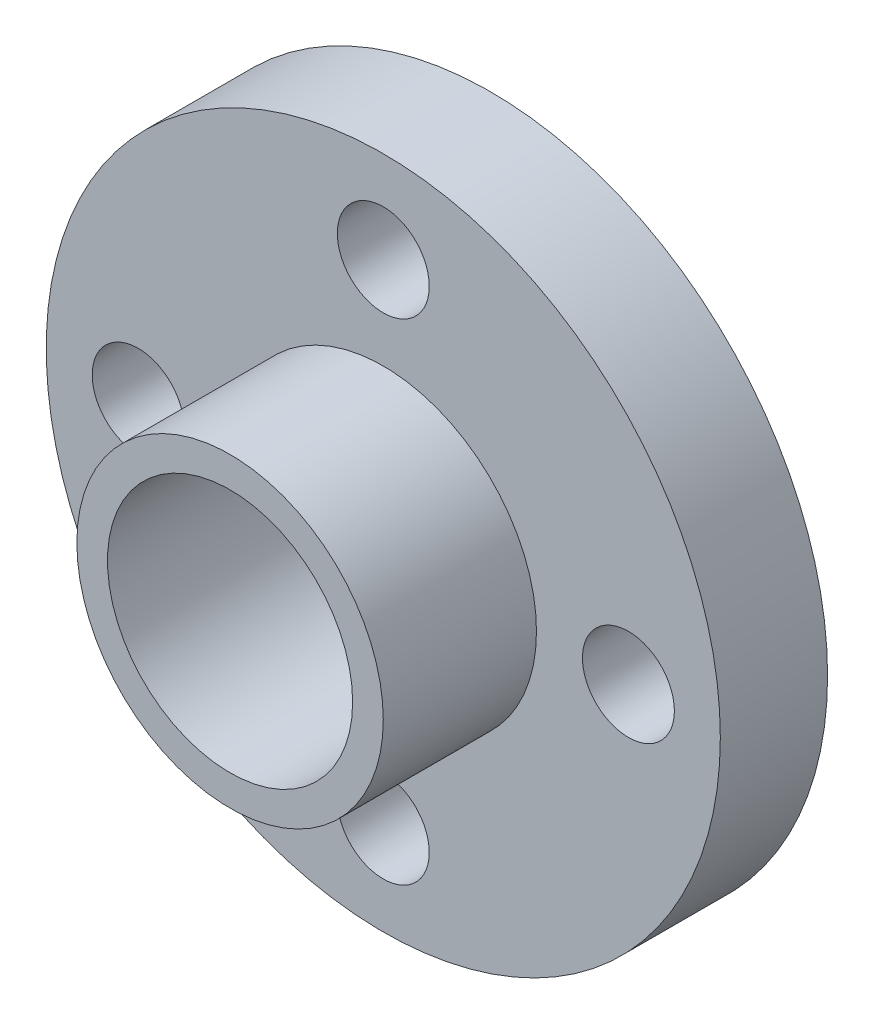
ISO-10303-21;
HEADER;
FILE_DESCRIPTION(('STEP AP214'),'2;1');
FILE_NAME('part.step','',(''),(''),'','','');
FILE_SCHEMA(('AUTOMOTIVE_DESIGN { 1 0 10303 214 1 1 1 1 }'));
ENDSEC;
DATA;
#1=APPLICATION_CONTEXT('core data for automotive mechanical design processes');
#2=APPLICATION_PROTOCOL_DEFINITION('international standard','automotive_design',2000,#1);
#3=PRODUCT_CONTEXT('',#1,'mechanical');
#4=PRODUCT('Part','Part','',(#3));
#5=PRODUCT_RELATED_PRODUCT_CATEGORY('part','',(#4));
#6=PRODUCT_DEFINITION_FORMATION('','',#4);
#7=PRODUCT_DEFINITION_CONTEXT('part definition',#1,'design');
#8=PRODUCT_DEFINITION('design','',#6,#7);
#9=PRODUCT_DEFINITION_SHAPE('','',#8);
#10=(LENGTH_UNIT() NAMED_UNIT(*) SI_UNIT(.MILLI.,.METRE.));
#11=(NAMED_UNIT(*) PLANE_ANGLE_UNIT() SI_UNIT($,.RADIAN.));
#12=(NAMED_UNIT(*) SI_UNIT($,.STERADIAN.) SOLID_ANGLE_UNIT());
#13=UNCERTAINTY_MEASURE_WITH_UNIT(LENGTH_MEASURE(1.E-05),#10,'distance_accuracy_value','');
#14=(GEOMETRIC_REPRESENTATION_CONTEXT(3) GLOBAL_UNCERTAINTY_ASSIGNED_CONTEXT((#13)) GLOBAL_UNIT_ASSIGNED_CONTEXT((#10,
#11,#12)) REPRESENTATION_CONTEXT('',''));
#15=CARTESIAN_POINT('',(0.,0.,0.));
#16=DIRECTION('',(0.,0.,1.));
#17=DIRECTION('',(1.,0.,0.));
#18=AXIS2_PLACEMENT_3D('',#15,#16,#17);
#19=CARTESIAN_POINT('',(0.,0.,2.));
#20=DIRECTION('',(0.,0.,-1.));
#21=DIRECTION('',(-1.,0.,0.));
#22=AXIS2_PLACEMENT_3D('',#19,#20,#21);
#23=CYLINDRICAL_SURFACE('',#22,5.);
#24=CARTESIAN_POINT('',(0.,0.,2.));
#25=DIRECTION('',(0.,0.,1.));
#26=DIRECTION('',(1.,0.,0.));
#27=AXIS2_PLACEMENT_3D('',#24,#25,#26);
#28=CIRCLE('',#27,5.);
#29=CARTESIAN_POINT('',(5.,0.,2.));
#30=VERTEX_POINT('',#29);
#31=EDGE_CURVE('E45',#30,#30,#28,.T.);
#32=ORIENTED_EDGE('',*,*,#31,.F.);
#33=EDGE_LOOP('',(#32));
#34=FACE_BOUND('',#33,.T.);
#35=CARTESIAN_POINT('',(0.,0.,0.));
#36=DIRECTION('',(0.,0.,1.));
#37=DIRECTION('',(1.,0.,0.));
#38=AXIS2_PLACEMENT_3D('',#35,#36,#37);
#39=CIRCLE('',#38,5.);
#40=CARTESIAN_POINT('',(5.,0.,0.));
#41=VERTEX_POINT('',#40);
#42=EDGE_CURVE('E51',#41,#41,#39,.T.);
#43=ORIENTED_EDGE('',*,*,#42,.T.);
#44=EDGE_LOOP('',(#43));
#45=FACE_BOUND('',#44,.T.);
#46=ADVANCED_FACE('F37',(#34,#45),#23,.T.);
#47=CARTESIAN_POINT('',(0.,0.,0.));
#48=DIRECTION('',(0.,0.,1.));
#49=DIRECTION('',(1.,0.,0.));
#50=AXIS2_PLACEMENT_3D('',#47,#48,#49);
#51=PLANE('',#50);
#52=CARTESIAN_POINT('',(0.,0.,0.));
#53=DIRECTION('',(0.,0.,1.));
#54=DIRECTION('',(1.,0.,0.));
#55=AXIS2_PLACEMENT_3D('',#52,#53,#54);
#56=CIRCLE('',#55,4.);
#57=CARTESIAN_POINT('',(4.,0.,0.));
#58=VERTEX_POINT('',#57);
#59=EDGE_CURVE('E149',#58,#58,#56,.T.);
#60=ORIENTED_EDGE('',*,*,#59,.T.);
#61=EDGE_LOOP('',(#60));
#62=FACE_BOUND('',#61,.T.);
#63=ORIENTED_EDGE('',*,*,#42,.F.);
#64=EDGE_LOOP('',(#63));
#65=FACE_BOUND('',#64,.T.);
#66=ADVANCED_FACE('F106',(#62,#65),#51,.F.);
#67=CARTESIAN_POINT('',(0.,0.,5.5));
#68=DIRECTION('',(0.,0.,-1.));
#69=DIRECTION('',(-1.,0.,0.));
#70=AXIS2_PLACEMENT_3D('',#67,#68,#69);
#71=CYLINDRICAL_SURFACE('',#70,11.);
#72=CARTESIAN_POINT('',(0.,0.,5.5));
#73=DIRECTION('',(0.,0.,1.));
#74=DIRECTION('',(1.,0.,0.));
#75=AXIS2_PLACEMENT_3D('',#72,#73,#74);
#76=CIRCLE('',#75,11.);
#77=CARTESIAN_POINT('',(11.,0.,5.5));
#78=VERTEX_POINT('',#77);
#79=EDGE_CURVE('E57',#78,#78,#76,.T.);
#80=ORIENTED_EDGE('',*,*,#79,.F.);
#81=EDGE_LOOP('',(#80));
#82=FACE_BOUND('',#81,.T.);
#83=CARTESIAN_POINT('',(0.,0.,2.));
#84=DIRECTION('',(0.,0.,1.));
#85=DIRECTION('',(1.,0.,0.));
#86=AXIS2_PLACEMENT_3D('',#83,#84,#85);
#87=CIRCLE('',#86,11.);
#88=CARTESIAN_POINT('',(11.,0.,2.));
#89=VERTEX_POINT('',#88);
#90=EDGE_CURVE('E61',#89,#89,#87,.T.);
#91=ORIENTED_EDGE('',*,*,#90,.T.);
#92=EDGE_LOOP('',(#91));
#93=FACE_BOUND('',#92,.T.);
#94=ADVANCED_FACE('F111',(#82,#93),#71,.T.);
#95=CARTESIAN_POINT('',(0.,0.,5.5));
#96=DIRECTION('',(0.,0.,1.));
#97=DIRECTION('',(1.,0.,0.));
#98=AXIS2_PLACEMENT_3D('',#95,#96,#97);
#99=PLANE('',#98);
#100=CARTESIAN_POINT('',(0.,8.,5.5));
#101=DIRECTION('',(0.,0.,1.));
#102=DIRECTION('',(1.,0.,0.));
#103=AXIS2_PLACEMENT_3D('',#100,#101,#102);
#104=CIRCLE('',#103,1.5);
#105=CARTESIAN_POINT('',(1.5,8.,5.5));
#106=VERTEX_POINT('',#105);
#107=EDGE_CURVE('E73',#106,#106,#104,.T.);
#108=ORIENTED_EDGE('',*,*,#107,.F.);
#109=EDGE_LOOP('',(#108));
#110=FACE_BOUND('',#109,.T.);
#111=CARTESIAN_POINT('',(8.00000000000023,2.25904099284255E-13,5.5));
#112=DIRECTION('',(0.,0.,1.));
#113=DIRECTION('',(1.,0.,0.));
#114=AXIS2_PLACEMENT_3D('',#111,#112,#113);
#115=CIRCLE('',#114,1.50000000000018);
#116=CARTESIAN_POINT('',(9.5000000000004,2.25904099284255E-13,5.5));
#117=VERTEX_POINT('',#116);
#118=EDGE_CURVE('E138',#117,#117,#115,.T.);
#119=ORIENTED_EDGE('',*,*,#118,.F.);
#120=EDGE_LOOP('',(#119));
#121=FACE_BOUND('',#120,.T.);
#122=CARTESIAN_POINT('',(4.51808198568511E-13,-8.,5.5));
#123=DIRECTION('',(0.,0.,1.));
#124=DIRECTION('',(1.,0.,0.));
#125=AXIS2_PLACEMENT_3D('',#122,#123,#124);
#126=CIRCLE('',#125,1.50000000000049);
#127=CARTESIAN_POINT('',(1.50000000000094,-8.,5.5));
#128=VERTEX_POINT('',#127);
#129=EDGE_CURVE('E142',#128,#128,#126,.T.);
#130=ORIENTED_EDGE('',*,*,#129,.F.);
#131=EDGE_LOOP('',(#130));
#132=FACE_BOUND('',#131,.T.);
#133=CARTESIAN_POINT('',(-7.99999999999977,-2.26883816723573E-13,5.5));
#134=DIRECTION('',(0.,0.,1.));
#135=DIRECTION('',(1.,0.,0.));
#136=AXIS2_PLACEMENT_3D('',#133,#134,#135);
#137=CIRCLE('',#136,1.50000000000036);
#138=CARTESIAN_POINT('',(-6.49999999999941,-2.26883816723573E-13,5.5));
#139=VERTEX_POINT('',#138);
#140=EDGE_CURVE('E146',#139,#139,#137,.T.);
#141=ORIENTED_EDGE('',*,*,#140,.F.);
#142=EDGE_LOOP('',(#141));
#143=FACE_BOUND('',#142,.T.);
#144=CARTESIAN_POINT('',(0.,0.,5.5));
#145=DIRECTION('',(0.,0.,1.));
#146=DIRECTION('',(1.,0.,0.));
#147=AXIS2_PLACEMENT_3D('',#144,#145,#146);
#148=CIRCLE('',#147,5.);
#149=CARTESIAN_POINT('',(5.,0.,5.5));
#150=VERTEX_POINT('',#149);
#151=EDGE_CURVE('E10',#150,#150,#148,.T.);
#152=ORIENTED_EDGE('',*,*,#151,.F.);
#153=EDGE_LOOP('',(#152));
#154=FACE_BOUND('',#153,.T.);
#155=ORIENTED_EDGE('',*,*,#79,.T.);
#156=EDGE_LOOP('',(#155));
#157=FACE_BOUND('',#156,.T.);
#158=ADVANCED_FACE('F102',(#110,#121,#132,#143,#154,#157),#99,.T.);
#159=CARTESIAN_POINT('',(0.,0.,2.));
#160=DIRECTION('',(0.,0.,1.));
#161=DIRECTION('',(1.,0.,0.));
#162=AXIS2_PLACEMENT_3D('',#159,#160,#161);
#163=PLANE('',#162);
#164=CARTESIAN_POINT('',(0.,8.,2.));
#165=DIRECTION('',(0.,0.,1.));
#166=DIRECTION('',(1.,0.,0.));
#167=AXIS2_PLACEMENT_3D('',#164,#165,#166);
#168=CIRCLE('',#167,1.5);
#169=CARTESIAN_POINT('',(1.5,8.,2.));
#170=VERTEX_POINT('',#169);
#171=EDGE_CURVE('E40',#170,#170,#168,.T.);
#172=ORIENTED_EDGE('',*,*,#171,.T.);
#173=EDGE_LOOP('',(#172));
#174=FACE_BOUND('',#173,.T.);
#175=CARTESIAN_POINT('',(8.00000000000023,2.25904099284255E-13,2.));
#176=DIRECTION('',(0.,0.,1.));
#177=DIRECTION('',(1.,0.,0.));
#178=AXIS2_PLACEMENT_3D('',#175,#176,#177);
#179=CIRCLE('',#178,1.50000000000018);
#180=CARTESIAN_POINT('',(9.5000000000004,2.25904099284255E-13,2.));
#181=VERTEX_POINT('',#180);
#182=EDGE_CURVE('E76',#181,#181,#179,.T.);
#183=ORIENTED_EDGE('',*,*,#182,.T.);
#184=EDGE_LOOP('',(#183));
#185=FACE_BOUND('',#184,.T.);
#186=CARTESIAN_POINT('',(4.51808198568511E-13,-8.,2.));
#187=DIRECTION('',(0.,0.,1.));
#188=DIRECTION('',(1.,0.,0.));
#189=AXIS2_PLACEMENT_3D('',#186,#187,#188);
#190=CIRCLE('',#189,1.50000000000049);
#191=CARTESIAN_POINT('',(1.50000000000094,-8.,2.));
#192=VERTEX_POINT('',#191);
#193=EDGE_CURVE('E72',#192,#192,#190,.T.);
#194=ORIENTED_EDGE('',*,*,#193,.T.);
#195=EDGE_LOOP('',(#194));
#196=FACE_BOUND('',#195,.T.);
#197=CARTESIAN_POINT('',(-7.99999999999977,-2.26883816723573E-13,2.));
#198=DIRECTION('',(0.,0.,1.));
#199=DIRECTION('',(1.,0.,0.));
#200=AXIS2_PLACEMENT_3D('',#197,#198,#199);
#201=CIRCLE('',#200,1.50000000000036);
#202=CARTESIAN_POINT('',(-6.49999999999941,-2.26883816723573E-13,2.));
#203=VERTEX_POINT('',#202);
#204=EDGE_CURVE('E68',#203,#203,#201,.T.);
#205=ORIENTED_EDGE('',*,*,#204,.T.);
#206=EDGE_LOOP('',(#205));
#207=FACE_BOUND('',#206,.T.);
#208=ORIENTED_EDGE('',*,*,#31,.T.);
#209=EDGE_LOOP('',(#208));
#210=FACE_BOUND('',#209,.T.);
#211=ORIENTED_EDGE('',*,*,#90,.F.);
#212=EDGE_LOOP('',(#211));
#213=FACE_BOUND('',#212,.T.);
#214=ADVANCED_FACE('F93',(#174,#185,#196,#207,#210,#213),#163,.F.);
#215=CARTESIAN_POINT('',(0.,0.,10.5));
#216=DIRECTION('',(0.,0.,-1.));
#217=DIRECTION('',(-1.,0.,0.));
#218=AXIS2_PLACEMENT_3D('',#215,#216,#217);
#219=CYLINDRICAL_SURFACE('',#218,5.);
#220=CARTESIAN_POINT('',(0.,0.,10.5));
#221=DIRECTION('',(0.,0.,1.));
#222=DIRECTION('',(1.,0.,0.));
#223=AXIS2_PLACEMENT_3D('',#220,#221,#222);
#224=CIRCLE('',#223,5.);
#225=CARTESIAN_POINT('',(5.,0.,10.5));
#226=VERTEX_POINT('',#225);
#227=EDGE_CURVE('E55',#226,#226,#224,.T.);
#228=ORIENTED_EDGE('',*,*,#227,.F.);
#229=EDGE_LOOP('',(#228));
#230=FACE_BOUND('',#229,.T.);
#231=ORIENTED_EDGE('',*,*,#151,.T.);
#232=EDGE_LOOP('',(#231));
#233=FACE_BOUND('',#232,.T.);
#234=ADVANCED_FACE('F91',(#230,#233),#219,.T.);
#235=CARTESIAN_POINT('',(0.,0.,10.5));
#236=DIRECTION('',(0.,0.,1.));
#237=DIRECTION('',(1.,0.,0.));
#238=AXIS2_PLACEMENT_3D('',#235,#236,#237);
#239=PLANE('',#238);
#240=CARTESIAN_POINT('',(0.,0.,10.5));
#241=DIRECTION('',(0.,0.,1.));
#242=DIRECTION('',(1.,0.,0.));
#243=AXIS2_PLACEMENT_3D('',#240,#241,#242);
#244=CIRCLE('',#243,4.);
#245=CARTESIAN_POINT('',(4.,0.,10.5));
#246=VERTEX_POINT('',#245);
#247=EDGE_CURVE('E154',#246,#246,#244,.T.);
#248=ORIENTED_EDGE('',*,*,#247,.F.);
#249=EDGE_LOOP('',(#248));
#250=FACE_BOUND('',#249,.T.);
#251=ORIENTED_EDGE('',*,*,#227,.T.);
#252=EDGE_LOOP('',(#251));
#253=FACE_BOUND('',#252,.T.);
#254=ADVANCED_FACE('F89',(#250,#253),#239,.T.);
#255=CARTESIAN_POINT('',(-7.99999999999977,-2.26883816723573E-13,0.5));
#256=DIRECTION('',(0.,0.,1.));
#257=DIRECTION('',(1.,0.,0.));
#258=AXIS2_PLACEMENT_3D('',#255,#256,#257);
#259=CYLINDRICAL_SURFACE('',#258,1.50000000000036);
#260=ORIENTED_EDGE('',*,*,#140,.T.);
#261=EDGE_LOOP('',(#260));
#262=FACE_BOUND('',#261,.T.);
#263=ORIENTED_EDGE('',*,*,#204,.F.);
#264=EDGE_LOOP('',(#263));
#265=FACE_BOUND('',#264,.T.);
#266=ADVANCED_FACE('F99',(#262,#265),#259,.F.);
#267=CARTESIAN_POINT('',(4.51808198568511E-13,-8.,0.5));
#268=DIRECTION('',(0.,0.,1.));
#269=DIRECTION('',(1.,0.,0.));
#270=AXIS2_PLACEMENT_3D('',#267,#268,#269);
#271=CYLINDRICAL_SURFACE('',#270,1.50000000000049);
#272=ORIENTED_EDGE('',*,*,#129,.T.);
#273=EDGE_LOOP('',(#272));
#274=FACE_BOUND('',#273,.T.);
#275=ORIENTED_EDGE('',*,*,#193,.F.);
#276=EDGE_LOOP('',(#275));
#277=FACE_BOUND('',#276,.T.);
#278=ADVANCED_FACE('F180',(#274,#277),#271,.F.);
#279=CARTESIAN_POINT('',(8.00000000000023,2.25904099284255E-13,0.5));
#280=DIRECTION('',(0.,0.,1.));
#281=DIRECTION('',(1.,0.,0.));
#282=AXIS2_PLACEMENT_3D('',#279,#280,#281);
#283=CYLINDRICAL_SURFACE('',#282,1.50000000000018);
#284=ORIENTED_EDGE('',*,*,#118,.T.);
#285=EDGE_LOOP('',(#284));
#286=FACE_BOUND('',#285,.T.);
#287=ORIENTED_EDGE('',*,*,#182,.F.);
#288=EDGE_LOOP('',(#287));
#289=FACE_BOUND('',#288,.T.);
#290=ADVANCED_FACE('F173',(#286,#289),#283,.F.);
#291=CARTESIAN_POINT('',(0.,8.,0.5));
#292=DIRECTION('',(0.,0.,1.));
#293=DIRECTION('',(1.,0.,0.));
#294=AXIS2_PLACEMENT_3D('',#291,#292,#293);
#295=CYLINDRICAL_SURFACE('',#294,1.5);
#296=ORIENTED_EDGE('',*,*,#107,.T.);
#297=EDGE_LOOP('',(#296));
#298=FACE_BOUND('',#297,.T.);
#299=ORIENTED_EDGE('',*,*,#171,.F.);
#300=EDGE_LOOP('',(#299));
#301=FACE_BOUND('',#300,.T.);
#302=ADVANCED_FACE('F167',(#298,#301),#295,.F.);
#303=CARTESIAN_POINT('',(0.,0.,0.));
#304=DIRECTION('',(0.,0.,1.));
#305=DIRECTION('',(1.,0.,0.));
#306=AXIS2_PLACEMENT_3D('',#303,#304,#305);
#307=CYLINDRICAL_SURFACE('',#306,4.);
#308=ORIENTED_EDGE('',*,*,#59,.F.);
#309=EDGE_LOOP('',(#308));
#310=FACE_BOUND('',#309,.T.);
#311=ORIENTED_EDGE('',*,*,#247,.T.);
#312=EDGE_LOOP('',(#311));
#313=FACE_BOUND('',#312,.T.);
#314=ADVANCED_FACE('F165',(#310,#313),#307,.F.);
#315=CLOSED_SHELL('',(#46,#66,#94,#158,#214,#234,#254,#266,#278,#290,#302,#314));
#316=MANIFOLD_SOLID_BREP('B2',#315);
#317=ADVANCED_BREP_SHAPE_REPRESENTATION('',(#18,#316),#14);
#318=SHAPE_DEFINITION_REPRESENTATION(#9,#317);
ENDSEC;
END-ISO-10303-21;
